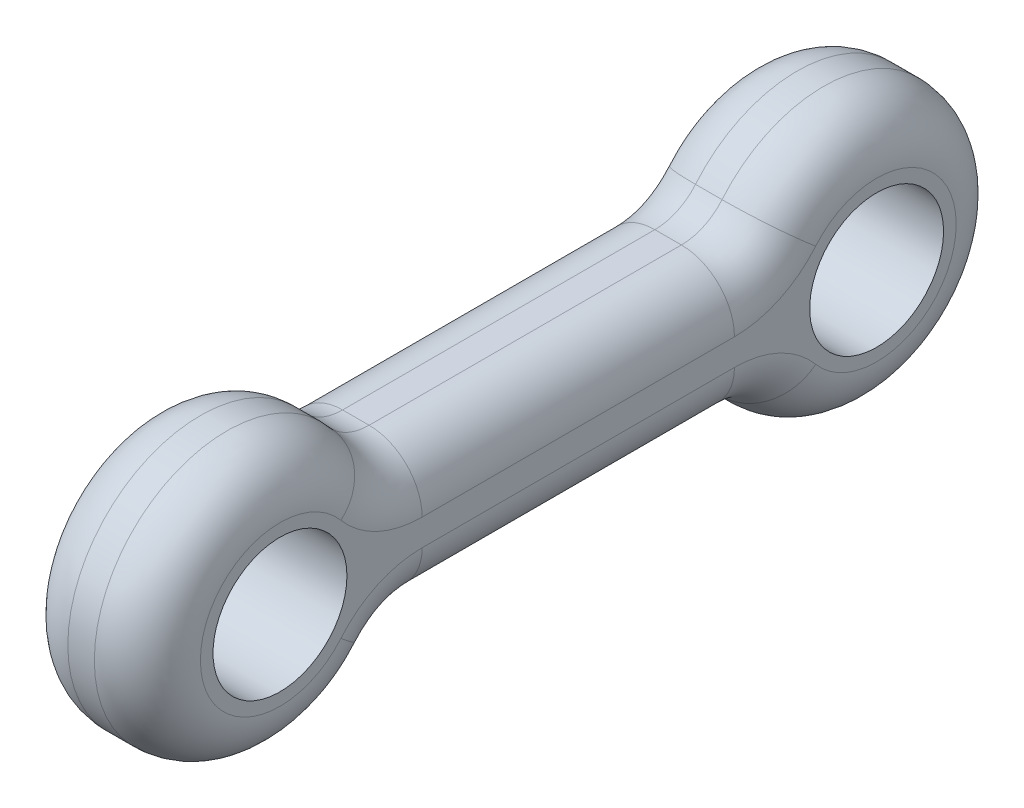
ISO-10303-21;
HEADER;
FILE_DESCRIPTION(('STEP AP214'),'2;1');
FILE_NAME('part.step','',(''),(''),'','','');
FILE_SCHEMA(('AUTOMOTIVE_DESIGN { 1 0 10303 214 1 1 1 1 }'));
ENDSEC;
DATA;
#1=APPLICATION_CONTEXT('core data for automotive mechanical design processes');
#2=APPLICATION_PROTOCOL_DEFINITION('international standard','automotive_design',2000,#1);
#3=PRODUCT_CONTEXT('',#1,'mechanical');
#4=PRODUCT('Part','Part','',(#3));
#5=PRODUCT_RELATED_PRODUCT_CATEGORY('part','',(#4));
#6=PRODUCT_DEFINITION_FORMATION('','',#4);
#7=PRODUCT_DEFINITION_CONTEXT('part definition',#1,'design');
#8=PRODUCT_DEFINITION('design','',#6,#7);
#9=PRODUCT_DEFINITION_SHAPE('','',#8);
#10=(LENGTH_UNIT() NAMED_UNIT(*) SI_UNIT(.MILLI.,.METRE.));
#11=(NAMED_UNIT(*) PLANE_ANGLE_UNIT() SI_UNIT($,.RADIAN.));
#12=(NAMED_UNIT(*) SI_UNIT($,.STERADIAN.) SOLID_ANGLE_UNIT());
#13=UNCERTAINTY_MEASURE_WITH_UNIT(LENGTH_MEASURE(1.E-05),#10,'distance_accuracy_value','');
#14=(GEOMETRIC_REPRESENTATION_CONTEXT(3) GLOBAL_UNCERTAINTY_ASSIGNED_CONTEXT((#13)) GLOBAL_UNIT_ASSIGNED_CONTEXT((#10,
#11,#12)) REPRESENTATION_CONTEXT('',''));
#15=CARTESIAN_POINT('',(0.,0.,0.));
#16=DIRECTION('',(0.,0.,1.));
#17=DIRECTION('',(1.,0.,0.));
#18=AXIS2_PLACEMENT_3D('',#15,#16,#17);
#19=CARTESIAN_POINT('',(0.,0.,0.));
#20=DIRECTION('',(1.,0.,0.));
#21=DIRECTION('',(0.,0.,-1.));
#22=AXIS2_PLACEMENT_3D('',#19,#20,#21);
#23=PLANE('',#22);
#24=CARTESIAN_POINT('',(0.,0.,45.));
#25=DIRECTION('',(1.,0.,0.));
#26=DIRECTION('',(0.,0.,-1.));
#27=AXIS2_PLACEMENT_3D('',#24,#25,#26);
#28=CIRCLE('',#27,5.05);
#29=CARTESIAN_POINT('',(0.,0.,39.95));
#30=VERTEX_POINT('',#29);
#31=EDGE_CURVE('E237',#30,#30,#28,.T.);
#32=ORIENTED_EDGE('',*,*,#31,.T.);
#33=EDGE_LOOP('',(#32));
#34=FACE_BOUND('',#33,.T.);
#35=CARTESIAN_POINT('',(0.,0.,0.));
#36=DIRECTION('',(1.,0.,0.));
#37=DIRECTION('',(0.,0.,-1.));
#38=AXIS2_PLACEMENT_3D('',#35,#36,#37);
#39=CIRCLE('',#38,5.05);
#40=CARTESIAN_POINT('',(0.,0.,-5.05));
#41=VERTEX_POINT('',#40);
#42=EDGE_CURVE('E224',#41,#41,#39,.T.);
#43=ORIENTED_EDGE('',*,*,#42,.T.);
#44=EDGE_LOOP('',(#43));
#45=FACE_BOUND('',#44,.T.);
#46=CARTESIAN_POINT('',(0.,9.,10.7238052947636));
#47=DIRECTION('',(1.,0.,0.));
#48=DIRECTION('',(0.,0.,-1.));
#49=AXIS2_PLACEMENT_3D('',#46,#47,#48);
#50=CIRCLE('',#49,8.);
#51=CARTESIAN_POINT('',(0.,3.85714285714286,4.59591655489869));
#52=VERTEX_POINT('',#51);
#53=CARTESIAN_POINT('',(0.,0.999999999999997,10.7238052947636));
#54=VERTEX_POINT('',#53);
#55=EDGE_CURVE('E301',#52,#54,#50,.F.);
#56=ORIENTED_EDGE('',*,*,#55,.F.);
#57=CARTESIAN_POINT('',(0.,0.,0.));
#58=DIRECTION('',(1.,0.,0.));
#59=DIRECTION('',(0.,0.,-1.));
#60=AXIS2_PLACEMENT_3D('',#57,#58,#59);
#61=CIRCLE('',#60,6.);
#62=CARTESIAN_POINT('',(0.,-3.85714285714286,4.59591655489869));
#63=VERTEX_POINT('',#62);
#64=EDGE_CURVE('E298',#52,#63,#61,.F.);
#65=ORIENTED_EDGE('',*,*,#64,.T.);
#66=CARTESIAN_POINT('',(0.,-9.,10.7238052947636));
#67=DIRECTION('',(1.,0.,0.));
#68=DIRECTION('',(0.,0.,-1.));
#69=AXIS2_PLACEMENT_3D('',#66,#67,#68);
#70=CIRCLE('',#69,8.);
#71=CARTESIAN_POINT('',(0.,-1.,10.7238052947636));
#72=VERTEX_POINT('',#71);
#73=EDGE_CURVE('E295',#72,#63,#70,.F.);
#74=ORIENTED_EDGE('',*,*,#73,.F.);
#75=DIRECTION('',(0.,0.,-1.));
#76=VECTOR('',#75,1.);
#77=CARTESIAN_POINT('',(0.,-0.999999999999991,0.));
#78=LINE('',#77,#76);
#79=CARTESIAN_POINT('',(0.,-1.00000000000003,34.2761947052364));
#80=VERTEX_POINT('',#79);
#81=EDGE_CURVE('E288',#72,#80,#78,.F.);
#82=ORIENTED_EDGE('',*,*,#81,.T.);
#83=CARTESIAN_POINT('',(0.,-9.00000000000003,34.2761947052364));
#84=DIRECTION('',(1.,0.,0.));
#85=DIRECTION('',(0.,0.,-1.));
#86=AXIS2_PLACEMENT_3D('',#83,#84,#85);
#87=CIRCLE('',#86,8.);
#88=CARTESIAN_POINT('',(0.,-3.85714285714287,40.4040834451013));
#89=VERTEX_POINT('',#88);
#90=EDGE_CURVE('E285',#89,#80,#87,.F.);
#91=ORIENTED_EDGE('',*,*,#90,.F.);
#92=CARTESIAN_POINT('',(0.,0.,45.));
#93=DIRECTION('',(1.,0.,0.));
#94=DIRECTION('',(0.,0.,-1.));
#95=AXIS2_PLACEMENT_3D('',#92,#93,#94);
#96=CIRCLE('',#95,6.);
#97=CARTESIAN_POINT('',(0.,3.85714285714284,40.4040834451013));
#98=VERTEX_POINT('',#97);
#99=EDGE_CURVE('E282',#89,#98,#96,.F.);
#100=ORIENTED_EDGE('',*,*,#99,.T.);
#101=CARTESIAN_POINT('',(0.,8.99999999999997,34.2761947052364));
#102=DIRECTION('',(1.,0.,0.));
#103=DIRECTION('',(0.,0.,-1.));
#104=AXIS2_PLACEMENT_3D('',#101,#102,#103);
#105=CIRCLE('',#104,8.);
#106=CARTESIAN_POINT('',(0.,0.999999999999973,34.2761947052363));
#107=VERTEX_POINT('',#106);
#108=EDGE_CURVE('E278',#107,#98,#105,.F.);
#109=ORIENTED_EDGE('',*,*,#108,.F.);
#110=DIRECTION('',(0.,0.,1.));
#111=VECTOR('',#110,1.);
#112=CARTESIAN_POINT('',(0.,1.00000000000001,0.));
#113=LINE('',#112,#111);
#114=EDGE_CURVE('E291',#107,#54,#113,.F.);
#115=ORIENTED_EDGE('',*,*,#114,.T.);
#116=EDGE_LOOP('',(#56,#65,#74,#82,#91,#100,#109,#115));
#117=FACE_BOUND('',#116,.T.);
#118=ADVANCED_FACE('F38',(#34,#45,#117),#23,.F.);
#119=CARTESIAN_POINT('',(10.,0.,0.));
#120=DIRECTION('',(1.,0.,0.));
#121=DIRECTION('',(0.,0.,-1.));
#122=AXIS2_PLACEMENT_3D('',#119,#120,#121);
#123=PLANE('',#122);
#124=CARTESIAN_POINT('',(10.,0.,45.));
#125=DIRECTION('',(1.,0.,0.));
#126=DIRECTION('',(0.,0.,-1.));
#127=AXIS2_PLACEMENT_3D('',#124,#125,#126);
#128=CIRCLE('',#127,5.05);
#129=CARTESIAN_POINT('',(10.,0.,39.95));
#130=VERTEX_POINT('',#129);
#131=EDGE_CURVE('E163',#130,#130,#128,.T.);
#132=ORIENTED_EDGE('',*,*,#131,.F.);
#133=EDGE_LOOP('',(#132));
#134=FACE_BOUND('',#133,.T.);
#135=CARTESIAN_POINT('',(10.,0.,0.));
#136=DIRECTION('',(1.,0.,0.));
#137=DIRECTION('',(0.,0.,-1.));
#138=AXIS2_PLACEMENT_3D('',#135,#136,#137);
#139=CIRCLE('',#138,5.05);
#140=CARTESIAN_POINT('',(10.,0.,-5.05));
#141=VERTEX_POINT('',#140);
#142=EDGE_CURVE('E231',#141,#141,#139,.T.);
#143=ORIENTED_EDGE('',*,*,#142,.F.);
#144=EDGE_LOOP('',(#143));
#145=FACE_BOUND('',#144,.T.);
#146=CARTESIAN_POINT('',(10.,-9.,10.7238052947636));
#147=DIRECTION('',(1.,0.,0.));
#148=DIRECTION('',(0.,0.,-1.));
#149=AXIS2_PLACEMENT_3D('',#146,#147,#148);
#150=CIRCLE('',#149,8.);
#151=CARTESIAN_POINT('',(10.,-3.85714285714286,4.59591655489869));
#152=VERTEX_POINT('',#151);
#153=CARTESIAN_POINT('',(10.,-1.,10.7238052947636));
#154=VERTEX_POINT('',#153);
#155=EDGE_CURVE('E262',#152,#154,#150,.T.);
#156=ORIENTED_EDGE('',*,*,#155,.F.);
#157=CARTESIAN_POINT('',(10.,0.,0.));
#158=DIRECTION('',(1.,0.,0.));
#159=DIRECTION('',(0.,0.,-1.));
#160=AXIS2_PLACEMENT_3D('',#157,#158,#159);
#161=CIRCLE('',#160,6.);
#162=CARTESIAN_POINT('',(10.,3.85714285714286,4.59591655489869));
#163=VERTEX_POINT('',#162);
#164=EDGE_CURVE('E259',#152,#163,#161,.T.);
#165=ORIENTED_EDGE('',*,*,#164,.T.);
#166=CARTESIAN_POINT('',(10.,9.,10.7238052947636));
#167=DIRECTION('',(1.,0.,0.));
#168=DIRECTION('',(0.,0.,-1.));
#169=AXIS2_PLACEMENT_3D('',#166,#167,#168);
#170=CIRCLE('',#169,8.);
#171=CARTESIAN_POINT('',(10.,0.999999999999997,10.7238052947636));
#172=VERTEX_POINT('',#171);
#173=EDGE_CURVE('E255',#172,#163,#170,.T.);
#174=ORIENTED_EDGE('',*,*,#173,.F.);
#175=DIRECTION('',(0.,0.,1.));
#176=VECTOR('',#175,1.);
#177=CARTESIAN_POINT('',(10.,0.999999999999971,36.3397459621556));
#178=LINE('',#177,#176);
#179=CARTESIAN_POINT('',(10.,0.999999999999973,34.2761947052363));
#180=VERTEX_POINT('',#179);
#181=EDGE_CURVE('E251',#172,#180,#178,.T.);
#182=ORIENTED_EDGE('',*,*,#181,.T.);
#183=CARTESIAN_POINT('',(10.,8.99999999999997,34.2761947052364));
#184=DIRECTION('',(1.,0.,0.));
#185=DIRECTION('',(0.,0.,-1.));
#186=AXIS2_PLACEMENT_3D('',#183,#184,#185);
#187=CIRCLE('',#186,8.);
#188=CARTESIAN_POINT('',(10.,3.85714285714284,40.4040834451013));
#189=VERTEX_POINT('',#188);
#190=EDGE_CURVE('E175',#189,#180,#187,.T.);
#191=ORIENTED_EDGE('',*,*,#190,.F.);
#192=CARTESIAN_POINT('',(10.,0.,45.));
#193=DIRECTION('',(1.,0.,0.));
#194=DIRECTION('',(0.,0.,-1.));
#195=AXIS2_PLACEMENT_3D('',#192,#193,#194);
#196=CIRCLE('',#195,6.);
#197=CARTESIAN_POINT('',(10.,-3.85714285714287,40.4040834451013));
#198=VERTEX_POINT('',#197);
#199=EDGE_CURVE('E157',#189,#198,#196,.T.);
#200=ORIENTED_EDGE('',*,*,#199,.T.);
#201=CARTESIAN_POINT('',(10.,-9.00000000000003,34.2761947052364));
#202=DIRECTION('',(1.,0.,0.));
#203=DIRECTION('',(0.,0.,-1.));
#204=AXIS2_PLACEMENT_3D('',#201,#202,#203);
#205=CIRCLE('',#204,8.);
#206=CARTESIAN_POINT('',(10.,-1.00000000000003,34.2761947052364));
#207=VERTEX_POINT('',#206);
#208=EDGE_CURVE('E151',#207,#198,#205,.T.);
#209=ORIENTED_EDGE('',*,*,#208,.F.);
#210=DIRECTION('',(0.,0.,-1.));
#211=VECTOR('',#210,1.);
#212=CARTESIAN_POINT('',(10.,-1.,8.66025403784439));
#213=LINE('',#212,#211);
#214=EDGE_CURVE('E154',#207,#154,#213,.T.);
#215=ORIENTED_EDGE('',*,*,#214,.T.);
#216=EDGE_LOOP('',(#156,#165,#174,#182,#191,#200,#209,#215));
#217=FACE_BOUND('',#216,.T.);
#218=ADVANCED_FACE('F153',(#134,#145,#217),#123,.T.);
#219=CARTESIAN_POINT('',(10.,0.,0.));
#220=DIRECTION('',(-1.,0.,0.));
#221=DIRECTION('',(0.,0.,1.));
#222=AXIS2_PLACEMENT_3D('',#219,#220,#221);
#223=CYLINDRICAL_SURFACE('',#222,10.);
#224=CARTESIAN_POINT('',(6.,0.,0.));
#225=DIRECTION('',(1.,0.,0.));
#226=DIRECTION('',(0.,0.,-1.));
#227=AXIS2_PLACEMENT_3D('',#224,#225,#226);
#228=CIRCLE('',#227,10.);
#229=CARTESIAN_POINT('',(6.,6.42857142857143,7.65986092483115));
#230=VERTEX_POINT('',#229);
#231=CARTESIAN_POINT('',(6.,-6.42857142857143,7.65986092483115));
#232=VERTEX_POINT('',#231);
#233=EDGE_CURVE('E323',#230,#232,#228,.F.);
#234=ORIENTED_EDGE('',*,*,#233,.T.);
#235=DIRECTION('',(-1.,0.,0.));
#236=VECTOR('',#235,1.);
#237=CARTESIAN_POINT('',(10.,-6.42857142857143,7.65986092483115));
#238=LINE('',#237,#236);
#239=CARTESIAN_POINT('',(4.,-6.42857142857143,7.65986092483115));
#240=VERTEX_POINT('',#239);
#241=EDGE_CURVE('E326',#232,#240,#238,.T.);
#242=ORIENTED_EDGE('',*,*,#241,.T.);
#243=CARTESIAN_POINT('',(4.,0.,0.));
#244=DIRECTION('',(1.,0.,0.));
#245=DIRECTION('',(0.,0.,-1.));
#246=AXIS2_PLACEMENT_3D('',#243,#244,#245);
#247=CIRCLE('',#246,10.);
#248=CARTESIAN_POINT('',(4.,6.42857142857143,7.65986092483115));
#249=VERTEX_POINT('',#248);
#250=EDGE_CURVE('E317',#240,#249,#247,.T.);
#251=ORIENTED_EDGE('',*,*,#250,.T.);
#252=DIRECTION('',(-1.,0.,0.));
#253=VECTOR('',#252,1.);
#254=CARTESIAN_POINT('',(10.,6.42857142857143,7.65986092483115));
#255=LINE('',#254,#253);
#256=EDGE_CURVE('E320',#249,#230,#255,.F.);
#257=ORIENTED_EDGE('',*,*,#256,.T.);
#258=EDGE_LOOP('',(#234,#242,#251,#257));
#259=FACE_BOUND('',#258,.T.);
#260=ADVANCED_FACE('F449',(#259),#223,.T.);
#261=CARTESIAN_POINT('',(10.,5.,8.66025403784439));
#262=DIRECTION('',(0.,-1.,0.));
#263=DIRECTION('',(0.,0.,-1.));
#264=AXIS2_PLACEMENT_3D('',#261,#262,#263);
#265=PLANE('',#264);
#266=DIRECTION('',(0.,0.,1.));
#267=VECTOR('',#266,1.);
#268=CARTESIAN_POINT('',(6.,5.,8.66025403784439));
#269=LINE('',#268,#267);
#270=CARTESIAN_POINT('',(6.,4.99999999999997,34.2761947052364));
#271=VERTEX_POINT('',#270);
#272=CARTESIAN_POINT('',(6.,5.,10.7238052947636));
#273=VERTEX_POINT('',#272);
#274=EDGE_CURVE('E271',#271,#273,#269,.F.);
#275=ORIENTED_EDGE('',*,*,#274,.T.);
#276=DIRECTION('',(1.,0.,0.));
#277=VECTOR('',#276,1.);
#278=CARTESIAN_POINT('',(0.,5.,10.7238052947636));
#279=LINE('',#278,#277);
#280=CARTESIAN_POINT('',(4.,5.,10.7238052947636));
#281=VERTEX_POINT('',#280);
#282=EDGE_CURVE('E275',#273,#281,#279,.F.);
#283=ORIENTED_EDGE('',*,*,#282,.T.);
#284=DIRECTION('',(0.,0.,1.));
#285=VECTOR('',#284,1.);
#286=CARTESIAN_POINT('',(4.,5.,8.66025403784439));
#287=LINE('',#286,#285);
#288=CARTESIAN_POINT('',(4.,4.99999999999997,34.2761947052364));
#289=VERTEX_POINT('',#288);
#290=EDGE_CURVE('E268',#281,#289,#287,.T.);
#291=ORIENTED_EDGE('',*,*,#290,.T.);
#292=DIRECTION('',(1.,0.,0.));
#293=VECTOR('',#292,1.);
#294=CARTESIAN_POINT('',(10.,4.99999999999997,34.2761947052364));
#295=LINE('',#294,#293);
#296=EDGE_CURVE('E265',#289,#271,#295,.T.);
#297=ORIENTED_EDGE('',*,*,#296,.T.);
#298=EDGE_LOOP('',(#275,#283,#291,#297));
#299=FACE_BOUND('',#298,.T.);
#300=ADVANCED_FACE('F404',(#299),#265,.F.);
#301=CARTESIAN_POINT('',(10.,0.,45.));
#302=DIRECTION('',(-1.,0.,0.));
#303=DIRECTION('',(0.,0.,1.));
#304=AXIS2_PLACEMENT_3D('',#301,#302,#303);
#305=CYLINDRICAL_SURFACE('',#304,10.);
#306=CARTESIAN_POINT('',(6.,0.,45.));
#307=DIRECTION('',(1.,0.,0.));
#308=DIRECTION('',(0.,0.,-1.));
#309=AXIS2_PLACEMENT_3D('',#306,#307,#308);
#310=CIRCLE('',#309,10.);
#311=CARTESIAN_POINT('',(6.,-6.42857142857145,37.3401390751689));
#312=VERTEX_POINT('',#311);
#313=CARTESIAN_POINT('',(6.,6.42857142857141,37.3401390751688));
#314=VERTEX_POINT('',#313);
#315=EDGE_CURVE('E48',#312,#314,#310,.F.);
#316=ORIENTED_EDGE('',*,*,#315,.T.);
#317=DIRECTION('',(-1.,0.,0.));
#318=VECTOR('',#317,1.);
#319=CARTESIAN_POINT('',(10.,6.42857142857141,37.3401390751688));
#320=LINE('',#319,#318);
#321=CARTESIAN_POINT('',(4.,6.42857142857141,37.3401390751688));
#322=VERTEX_POINT('',#321);
#323=EDGE_CURVE('E11',#314,#322,#320,.T.);
#324=ORIENTED_EDGE('',*,*,#323,.T.);
#325=CARTESIAN_POINT('',(4.,0.,45.));
#326=DIRECTION('',(1.,0.,0.));
#327=DIRECTION('',(0.,0.,-1.));
#328=AXIS2_PLACEMENT_3D('',#325,#326,#327);
#329=CIRCLE('',#328,10.);
#330=CARTESIAN_POINT('',(4.,-6.42857142857145,37.3401390751689));
#331=VERTEX_POINT('',#330);
#332=EDGE_CURVE('E330',#322,#331,#329,.T.);
#333=ORIENTED_EDGE('',*,*,#332,.T.);
#334=DIRECTION('',(-1.,0.,0.));
#335=VECTOR('',#334,1.);
#336=CARTESIAN_POINT('',(10.,-6.42857142857145,37.3401390751689));
#337=LINE('',#336,#335);
#338=EDGE_CURVE('E59',#331,#312,#337,.F.);
#339=ORIENTED_EDGE('',*,*,#338,.T.);
#340=EDGE_LOOP('',(#316,#324,#333,#339));
#341=FACE_BOUND('',#340,.T.);
#342=ADVANCED_FACE('F388',(#341),#305,.T.);
#343=CARTESIAN_POINT('',(10.,-5.,8.66025403784439));
#344=DIRECTION('',(0.,1.,0.));
#345=DIRECTION('',(0.,0.,1.));
#346=AXIS2_PLACEMENT_3D('',#343,#344,#345);
#347=PLANE('',#346);
#348=DIRECTION('',(0.,0.,-1.));
#349=VECTOR('',#348,1.);
#350=CARTESIAN_POINT('',(4.,-5.,8.66025403784439));
#351=LINE('',#350,#349);
#352=CARTESIAN_POINT('',(4.,-5.00000000000003,34.2761947052364));
#353=VERTEX_POINT('',#352);
#354=CARTESIAN_POINT('',(4.,-5.,10.7238052947636));
#355=VERTEX_POINT('',#354);
#356=EDGE_CURVE('E307',#353,#355,#351,.T.);
#357=ORIENTED_EDGE('',*,*,#356,.T.);
#358=DIRECTION('',(1.,0.,0.));
#359=VECTOR('',#358,1.);
#360=CARTESIAN_POINT('',(10.,-5.,10.7238052947636));
#361=LINE('',#360,#359);
#362=CARTESIAN_POINT('',(6.,-5.,10.7238052947636));
#363=VERTEX_POINT('',#362);
#364=EDGE_CURVE('E314',#355,#363,#361,.T.);
#365=ORIENTED_EDGE('',*,*,#364,.T.);
#366=DIRECTION('',(0.,0.,-1.));
#367=VECTOR('',#366,1.);
#368=CARTESIAN_POINT('',(6.,-5.00000000000003,36.3397459621556));
#369=LINE('',#368,#367);
#370=CARTESIAN_POINT('',(6.,-5.00000000000003,34.2761947052364));
#371=VERTEX_POINT('',#370);
#372=EDGE_CURVE('E310',#363,#371,#369,.F.);
#373=ORIENTED_EDGE('',*,*,#372,.T.);
#374=DIRECTION('',(1.,0.,0.));
#375=VECTOR('',#374,1.);
#376=CARTESIAN_POINT('',(0.,-5.00000000000003,34.2761947052364));
#377=LINE('',#376,#375);
#378=EDGE_CURVE('E304',#371,#353,#377,.F.);
#379=ORIENTED_EDGE('',*,*,#378,.T.);
#380=EDGE_LOOP('',(#357,#365,#373,#379));
#381=FACE_BOUND('',#380,.T.);
#382=ADVANCED_FACE('F420',(#381),#347,.F.);
#383=CARTESIAN_POINT('',(10.,0.,45.));
#384=DIRECTION('',(-1.,0.,0.));
#385=DIRECTION('',(0.,0.,1.));
#386=AXIS2_PLACEMENT_3D('',#383,#384,#385);
#387=CYLINDRICAL_SURFACE('',#386,5.05);
#388=ORIENTED_EDGE('',*,*,#131,.T.);
#389=EDGE_LOOP('',(#388));
#390=FACE_BOUND('',#389,.T.);
#391=ORIENTED_EDGE('',*,*,#31,.F.);
#392=EDGE_LOOP('',(#391));
#393=FACE_BOUND('',#392,.T.);
#394=ADVANCED_FACE('F469',(#390,#393),#387,.F.);
#395=CARTESIAN_POINT('',(10.,0.,0.));
#396=DIRECTION('',(-1.,0.,0.));
#397=DIRECTION('',(0.,0.,1.));
#398=AXIS2_PLACEMENT_3D('',#395,#396,#397);
#399=CYLINDRICAL_SURFACE('',#398,5.05);
#400=ORIENTED_EDGE('',*,*,#142,.T.);
#401=EDGE_LOOP('',(#400));
#402=FACE_BOUND('',#401,.T.);
#403=ORIENTED_EDGE('',*,*,#42,.F.);
#404=EDGE_LOOP('',(#403));
#405=FACE_BOUND('',#404,.T.);
#406=ADVANCED_FACE('F487',(#402,#405),#399,.F.);
#407=CARTESIAN_POINT('',(4.,-1.,8.66025403784439));
#408=DIRECTION('',(0.,0.,-1.));
#409=DIRECTION('',(0.,1.,0.));
#410=AXIS2_PLACEMENT_3D('',#407,#408,#409);
#411=CYLINDRICAL_SURFACE('',#410,4.);
#412=CARTESIAN_POINT('',(4.,-1.00000000000003,34.2761947052364));
#413=DIRECTION('',(0.,0.,1.));
#414=DIRECTION('',(0.,-1.,0.));
#415=AXIS2_PLACEMENT_3D('',#412,#413,#414);
#416=CIRCLE('',#415,4.);
#417=EDGE_CURVE('E215',#80,#353,#416,.T.);
#418=ORIENTED_EDGE('',*,*,#417,.F.);
#419=ORIENTED_EDGE('',*,*,#81,.F.);
#420=CARTESIAN_POINT('',(4.,-1.,10.7238052947636));
#421=DIRECTION('',(0.,0.,-1.));
#422=DIRECTION('',(0.,1.,0.));
#423=AXIS2_PLACEMENT_3D('',#420,#421,#422);
#424=CIRCLE('',#423,4.);
#425=EDGE_CURVE('E42',#355,#72,#424,.T.);
#426=ORIENTED_EDGE('',*,*,#425,.F.);
#427=ORIENTED_EDGE('',*,*,#356,.F.);
#428=EDGE_LOOP('',(#418,#419,#426,#427));
#429=FACE_BOUND('',#428,.T.);
#430=ADVANCED_FACE('F40',(#429),#411,.T.);
#431=CARTESIAN_POINT('',(4.,-9.,10.7238052947636));
#432=DIRECTION('',(1.,0.,0.));
#433=DIRECTION('',(0.,0.,-1.));
#434=AXIS2_PLACEMENT_3D('',#431,#432,#433);
#435=TOROIDAL_SURFACE('',#434,8.,4.);
#436=ORIENTED_EDGE('',*,*,#425,.T.);
#437=ORIENTED_EDGE('',*,*,#73,.T.);
#438=CARTESIAN_POINT('',(4.,-3.85714285714286,4.59591655489869));
#439=DIRECTION('',(0.,0.765986092483114,0.642857142857143));
#440=DIRECTION('',(0.,-0.642857142857143,0.765986092483115));
#441=AXIS2_PLACEMENT_3D('',#438,#439,#440);
#442=CIRCLE('',#441,4.);
#443=EDGE_CURVE('E212',#240,#63,#442,.F.);
#444=ORIENTED_EDGE('',*,*,#443,.F.);
#445=CARTESIAN_POINT('',(4.,-9.,10.7238052947636));
#446=DIRECTION('',(1.,0.,0.));
#447=DIRECTION('',(0.,0.,-1.));
#448=AXIS2_PLACEMENT_3D('',#445,#446,#447);
#449=CIRCLE('',#448,4.);
#450=EDGE_CURVE('E208',#355,#240,#449,.F.);
#451=ORIENTED_EDGE('',*,*,#450,.F.);
#452=EDGE_LOOP('',(#436,#437,#444,#451));
#453=FACE_BOUND('',#452,.T.);
#454=ADVANCED_FACE('F447',(#453),#435,.T.);
#455=CARTESIAN_POINT('',(4.,-9.00000000000003,34.2761947052364));
#456=DIRECTION('',(1.,0.,0.));
#457=DIRECTION('',(0.,0.,-1.));
#458=AXIS2_PLACEMENT_3D('',#455,#456,#457);
#459=TOROIDAL_SURFACE('',#458,8.,4.);
#460=ORIENTED_EDGE('',*,*,#90,.T.);
#461=ORIENTED_EDGE('',*,*,#417,.T.);
#462=CARTESIAN_POINT('',(4.,-9.00000000000003,34.2761947052364));
#463=DIRECTION('',(1.,0.,0.));
#464=DIRECTION('',(0.,0.,-1.));
#465=AXIS2_PLACEMENT_3D('',#462,#463,#464);
#466=CIRCLE('',#465,4.);
#467=EDGE_CURVE('E204',#331,#353,#466,.F.);
#468=ORIENTED_EDGE('',*,*,#467,.F.);
#469=CARTESIAN_POINT('',(4.,-3.85714285714287,40.4040834451013));
#470=DIRECTION('',(0.,0.765986092483113,-0.642857142857145));
#471=DIRECTION('',(0.,0.642857142857145,0.765986092483113));
#472=AXIS2_PLACEMENT_3D('',#469,#470,#471);
#473=CIRCLE('',#472,4.);
#474=EDGE_CURVE('E200',#89,#331,#473,.F.);
#475=ORIENTED_EDGE('',*,*,#474,.F.);
#476=EDGE_LOOP('',(#460,#461,#468,#475));
#477=FACE_BOUND('',#476,.T.);
#478=ADVANCED_FACE('F415',(#477),#459,.T.);
#479=CARTESIAN_POINT('',(4.,0.,0.));
#480=DIRECTION('',(1.,0.,0.));
#481=DIRECTION('',(0.,0.,-1.));
#482=AXIS2_PLACEMENT_3D('',#479,#480,#481);
#483=TOROIDAL_SURFACE('',#482,6.,4.);
#484=ORIENTED_EDGE('',*,*,#443,.T.);
#485=ORIENTED_EDGE('',*,*,#64,.F.);
#486=CARTESIAN_POINT('',(4.,3.85714285714285,4.59591655489869));
#487=DIRECTION('',(0.,-0.765986092483115,0.642857142857143));
#488=DIRECTION('',(0.,-0.642857142857143,-0.765986092483115));
#489=AXIS2_PLACEMENT_3D('',#486,#487,#488);
#490=CIRCLE('',#489,4.);
#491=EDGE_CURVE('E192',#249,#52,#490,.T.);
#492=ORIENTED_EDGE('',*,*,#491,.F.);
#493=ORIENTED_EDGE('',*,*,#250,.F.);
#494=EDGE_LOOP('',(#484,#485,#492,#493));
#495=FACE_BOUND('',#494,.T.);
#496=ADVANCED_FACE('F445',(#495),#483,.T.);
#497=CARTESIAN_POINT('',(10.,-9.,10.7238052947636));
#498=DIRECTION('',(-1.,0.,0.));
#499=DIRECTION('',(0.,0.,1.));
#500=AXIS2_PLACEMENT_3D('',#497,#498,#499);
#501=CYLINDRICAL_SURFACE('',#500,4.);
#502=ORIENTED_EDGE('',*,*,#450,.T.);
#503=ORIENTED_EDGE('',*,*,#241,.F.);
#504=CARTESIAN_POINT('',(6.,-9.,10.7238052947636));
#505=DIRECTION('',(1.,0.,0.));
#506=DIRECTION('',(0.,0.,-1.));
#507=AXIS2_PLACEMENT_3D('',#504,#505,#506);
#508=CIRCLE('',#507,4.);
#509=EDGE_CURVE('E183',#363,#232,#508,.F.);
#510=ORIENTED_EDGE('',*,*,#509,.F.);
#511=ORIENTED_EDGE('',*,*,#364,.F.);
#512=EDGE_LOOP('',(#502,#503,#510,#511));
#513=FACE_BOUND('',#512,.T.);
#514=ADVANCED_FACE('F425',(#513),#501,.F.);
#515=CARTESIAN_POINT('',(6.,-0.999999999999991,0.));
#516=DIRECTION('',(0.,0.,1.));
#517=DIRECTION('',(0.,-1.,0.));
#518=AXIS2_PLACEMENT_3D('',#515,#516,#517);
#519=CYLINDRICAL_SURFACE('',#518,4.);
#520=CARTESIAN_POINT('',(6.,-1.00000000000003,34.2761947052364));
#521=DIRECTION('',(0.,0.,1.));
#522=DIRECTION('',(0.,-1.,0.));
#523=AXIS2_PLACEMENT_3D('',#520,#521,#522);
#524=CIRCLE('',#523,4.);
#525=EDGE_CURVE('E169',#371,#207,#524,.T.);
#526=ORIENTED_EDGE('',*,*,#525,.F.);
#527=ORIENTED_EDGE('',*,*,#372,.F.);
#528=CARTESIAN_POINT('',(6.,-1.,10.7238052947636));
#529=DIRECTION('',(0.,0.,-1.));
#530=DIRECTION('',(0.,1.,0.));
#531=AXIS2_PLACEMENT_3D('',#528,#529,#530);
#532=CIRCLE('',#531,4.);
#533=EDGE_CURVE('E172',#154,#363,#532,.T.);
#534=ORIENTED_EDGE('',*,*,#533,.F.);
#535=ORIENTED_EDGE('',*,*,#214,.F.);
#536=EDGE_LOOP('',(#526,#527,#534,#535));
#537=FACE_BOUND('',#536,.T.);
#538=ADVANCED_FACE('F167',(#537),#519,.T.);
#539=CARTESIAN_POINT('',(10.,-9.00000000000003,34.2761947052364));
#540=DIRECTION('',(-1.,0.,0.));
#541=DIRECTION('',(0.,0.,1.));
#542=AXIS2_PLACEMENT_3D('',#539,#540,#541);
#543=CYLINDRICAL_SURFACE('',#542,4.);
#544=ORIENTED_EDGE('',*,*,#467,.T.);
#545=ORIENTED_EDGE('',*,*,#378,.F.);
#546=CARTESIAN_POINT('',(6.,-9.00000000000003,34.2761947052364));
#547=DIRECTION('',(1.,0.,0.));
#548=DIRECTION('',(0.,0.,-1.));
#549=AXIS2_PLACEMENT_3D('',#546,#547,#548);
#550=CIRCLE('',#549,4.);
#551=EDGE_CURVE('E178',#312,#371,#550,.F.);
#552=ORIENTED_EDGE('',*,*,#551,.F.);
#553=ORIENTED_EDGE('',*,*,#338,.F.);
#554=EDGE_LOOP('',(#544,#545,#552,#553));
#555=FACE_BOUND('',#554,.T.);
#556=ADVANCED_FACE('F417',(#555),#543,.F.);
#557=CARTESIAN_POINT('',(4.,0.,45.));
#558=DIRECTION('',(1.,0.,0.));
#559=DIRECTION('',(0.,0.,-1.));
#560=AXIS2_PLACEMENT_3D('',#557,#558,#559);
#561=TOROIDAL_SURFACE('',#560,6.,4.);
#562=ORIENTED_EDGE('',*,*,#474,.T.);
#563=ORIENTED_EDGE('',*,*,#332,.F.);
#564=CARTESIAN_POINT('',(4.,3.85714285714284,40.4040834451013));
#565=DIRECTION('',(0.,-0.765986092483116,-0.642857142857141));
#566=DIRECTION('',(0.,0.642857142857141,-0.765986092483117));
#567=AXIS2_PLACEMENT_3D('',#564,#565,#566);
#568=CIRCLE('',#567,4.);
#569=EDGE_CURVE('E185',#98,#322,#568,.T.);
#570=ORIENTED_EDGE('',*,*,#569,.F.);
#571=ORIENTED_EDGE('',*,*,#99,.F.);
#572=EDGE_LOOP('',(#562,#563,#570,#571));
#573=FACE_BOUND('',#572,.T.);
#574=ADVANCED_FACE('F386',(#573),#561,.T.);
#575=CARTESIAN_POINT('',(4.,0.999999999999999,8.66025403784438));
#576=DIRECTION('',(0.,0.,1.));
#577=DIRECTION('',(0.,-1.,0.));
#578=AXIS2_PLACEMENT_3D('',#575,#576,#577);
#579=CYLINDRICAL_SURFACE('',#578,4.);
#580=CARTESIAN_POINT('',(4.,0.999999999999997,10.7238052947636));
#581=DIRECTION('',(0.,0.,-1.));
#582=DIRECTION('',(0.,1.,0.));
#583=AXIS2_PLACEMENT_3D('',#580,#581,#582);
#584=CIRCLE('',#583,4.);
#585=EDGE_CURVE('E196',#54,#281,#584,.T.);
#586=ORIENTED_EDGE('',*,*,#585,.F.);
#587=ORIENTED_EDGE('',*,*,#114,.F.);
#588=CARTESIAN_POINT('',(4.,0.999999999999972,34.2761947052363));
#589=DIRECTION('',(0.,0.,1.));
#590=DIRECTION('',(0.,-1.,0.));
#591=AXIS2_PLACEMENT_3D('',#588,#589,#590);
#592=CIRCLE('',#591,4.);
#593=EDGE_CURVE('E373',#289,#107,#592,.T.);
#594=ORIENTED_EDGE('',*,*,#593,.F.);
#595=ORIENTED_EDGE('',*,*,#290,.F.);
#596=EDGE_LOOP('',(#586,#587,#594,#595));
#597=FACE_BOUND('',#596,.T.);
#598=ADVANCED_FACE('F411',(#597),#579,.T.);
#599=CARTESIAN_POINT('',(4.,9.,10.7238052947636));
#600=DIRECTION('',(1.,0.,0.));
#601=DIRECTION('',(0.,0.,-1.));
#602=AXIS2_PLACEMENT_3D('',#599,#600,#601);
#603=TOROIDAL_SURFACE('',#602,8.,4.);
#604=ORIENTED_EDGE('',*,*,#55,.T.);
#605=ORIENTED_EDGE('',*,*,#585,.T.);
#606=CARTESIAN_POINT('',(4.,9.,10.7238052947636));
#607=DIRECTION('',(1.,0.,0.));
#608=DIRECTION('',(0.,0.,-1.));
#609=AXIS2_PLACEMENT_3D('',#606,#607,#608);
#610=CIRCLE('',#609,4.);
#611=EDGE_CURVE('E369',#249,#281,#610,.F.);
#612=ORIENTED_EDGE('',*,*,#611,.F.);
#613=ORIENTED_EDGE('',*,*,#491,.T.);
#614=EDGE_LOOP('',(#604,#605,#612,#613));
#615=FACE_BOUND('',#614,.T.);
#616=ADVANCED_FACE('F442',(#615),#603,.T.);
#617=CARTESIAN_POINT('',(6.,-9.,10.7238052947636));
#618=DIRECTION('',(1.,0.,0.));
#619=DIRECTION('',(0.,0.,-1.));
#620=AXIS2_PLACEMENT_3D('',#617,#618,#619);
#621=TOROIDAL_SURFACE('',#620,8.,4.);
#622=ORIENTED_EDGE('',*,*,#533,.T.);
#623=ORIENTED_EDGE('',*,*,#509,.T.);
#624=CARTESIAN_POINT('',(6.,-3.85714285714286,4.59591655489869));
#625=DIRECTION('',(0.,0.765986092483115,0.642857142857143));
#626=DIRECTION('',(0.,-0.642857142857143,0.765986092483115));
#627=AXIS2_PLACEMENT_3D('',#624,#625,#626);
#628=CIRCLE('',#627,4.);
#629=EDGE_CURVE('E365',#152,#232,#628,.F.);
#630=ORIENTED_EDGE('',*,*,#629,.F.);
#631=ORIENTED_EDGE('',*,*,#155,.T.);
#632=EDGE_LOOP('',(#622,#623,#630,#631));
#633=FACE_BOUND('',#632,.T.);
#634=ADVANCED_FACE('F428',(#633),#621,.T.);
#635=CARTESIAN_POINT('',(6.,-9.00000000000003,34.2761947052364));
#636=DIRECTION('',(1.,0.,0.));
#637=DIRECTION('',(0.,0.,-1.));
#638=AXIS2_PLACEMENT_3D('',#635,#636,#637);
#639=TOROIDAL_SURFACE('',#638,8.,4.);
#640=ORIENTED_EDGE('',*,*,#525,.T.);
#641=ORIENTED_EDGE('',*,*,#208,.T.);
#642=CARTESIAN_POINT('',(6.,-3.85714285714287,40.4040834451013));
#643=DIRECTION('',(0.,0.765986092483113,-0.642857142857145));
#644=DIRECTION('',(0.,0.642857142857145,0.765986092483113));
#645=AXIS2_PLACEMENT_3D('',#642,#643,#644);
#646=CIRCLE('',#645,4.);
#647=EDGE_CURVE('E362',#312,#198,#646,.F.);
#648=ORIENTED_EDGE('',*,*,#647,.F.);
#649=ORIENTED_EDGE('',*,*,#551,.T.);
#650=EDGE_LOOP('',(#640,#641,#648,#649));
#651=FACE_BOUND('',#650,.T.);
#652=ADVANCED_FACE('F177',(#651),#639,.T.);
#653=CARTESIAN_POINT('',(4.,8.99999999999997,34.2761947052364));
#654=DIRECTION('',(1.,0.,0.));
#655=DIRECTION('',(0.,0.,-1.));
#656=AXIS2_PLACEMENT_3D('',#653,#654,#655);
#657=TOROIDAL_SURFACE('',#656,8.,4.);
#658=ORIENTED_EDGE('',*,*,#108,.T.);
#659=ORIENTED_EDGE('',*,*,#569,.T.);
#660=CARTESIAN_POINT('',(4.,8.99999999999997,34.2761947052364));
#661=DIRECTION('',(1.,0.,0.));
#662=DIRECTION('',(0.,0.,-1.));
#663=AXIS2_PLACEMENT_3D('',#660,#661,#662);
#664=CIRCLE('',#663,4.);
#665=EDGE_CURVE('E359',#289,#322,#664,.F.);
#666=ORIENTED_EDGE('',*,*,#665,.F.);
#667=ORIENTED_EDGE('',*,*,#593,.T.);
#668=EDGE_LOOP('',(#658,#659,#666,#667));
#669=FACE_BOUND('',#668,.T.);
#670=ADVANCED_FACE('F382',(#669),#657,.T.);
#671=CARTESIAN_POINT('',(10.,9.,10.7238052947636));
#672=DIRECTION('',(-1.,0.,0.));
#673=DIRECTION('',(0.,0.,1.));
#674=AXIS2_PLACEMENT_3D('',#671,#672,#673);
#675=CYLINDRICAL_SURFACE('',#674,4.);
#676=ORIENTED_EDGE('',*,*,#611,.T.);
#677=ORIENTED_EDGE('',*,*,#282,.F.);
#678=CARTESIAN_POINT('',(6.,9.,10.7238052947636));
#679=DIRECTION('',(1.,0.,0.));
#680=DIRECTION('',(0.,0.,-1.));
#681=AXIS2_PLACEMENT_3D('',#678,#679,#680);
#682=CIRCLE('',#681,4.);
#683=EDGE_CURVE('E355',#230,#273,#682,.F.);
#684=ORIENTED_EDGE('',*,*,#683,.F.);
#685=ORIENTED_EDGE('',*,*,#256,.F.);
#686=EDGE_LOOP('',(#676,#677,#684,#685));
#687=FACE_BOUND('',#686,.T.);
#688=ADVANCED_FACE('F439',(#687),#675,.F.);
#689=CARTESIAN_POINT('',(6.,0.,0.));
#690=DIRECTION('',(1.,0.,0.));
#691=DIRECTION('',(0.,0.,-1.));
#692=AXIS2_PLACEMENT_3D('',#689,#690,#691);
#693=TOROIDAL_SURFACE('',#692,6.,4.);
#694=ORIENTED_EDGE('',*,*,#629,.T.);
#695=ORIENTED_EDGE('',*,*,#233,.F.);
#696=CARTESIAN_POINT('',(6.,3.85714285714286,4.59591655489869));
#697=DIRECTION('',(0.,-0.765986092483115,0.642857142857143));
#698=DIRECTION('',(0.,-0.642857142857143,-0.765986092483115));
#699=AXIS2_PLACEMENT_3D('',#696,#697,#698);
#700=CIRCLE('',#699,4.);
#701=EDGE_CURVE('E351',#163,#230,#700,.T.);
#702=ORIENTED_EDGE('',*,*,#701,.F.);
#703=ORIENTED_EDGE('',*,*,#164,.F.);
#704=EDGE_LOOP('',(#694,#695,#702,#703));
#705=FACE_BOUND('',#704,.T.);
#706=ADVANCED_FACE('F433',(#705),#693,.T.);
#707=CARTESIAN_POINT('',(6.,0.,45.));
#708=DIRECTION('',(1.,0.,0.));
#709=DIRECTION('',(0.,0.,-1.));
#710=AXIS2_PLACEMENT_3D('',#707,#708,#709);
#711=TOROIDAL_SURFACE('',#710,6.,4.);
#712=ORIENTED_EDGE('',*,*,#647,.T.);
#713=ORIENTED_EDGE('',*,*,#199,.F.);
#714=CARTESIAN_POINT('',(6.,3.85714285714284,40.4040834451013));
#715=DIRECTION('',(0.,-0.765986092483116,-0.642857142857141));
#716=DIRECTION('',(0.,0.642857142857141,-0.765986092483116));
#717=AXIS2_PLACEMENT_3D('',#714,#715,#716);
#718=CIRCLE('',#717,4.);
#719=EDGE_CURVE('E347',#314,#189,#718,.T.);
#720=ORIENTED_EDGE('',*,*,#719,.F.);
#721=ORIENTED_EDGE('',*,*,#315,.F.);
#722=EDGE_LOOP('',(#712,#713,#720,#721));
#723=FACE_BOUND('',#722,.T.);
#724=ADVANCED_FACE('F395',(#723),#711,.T.);
#725=CARTESIAN_POINT('',(10.,8.99999999999997,34.2761947052364));
#726=DIRECTION('',(-1.,0.,0.));
#727=DIRECTION('',(0.,0.,1.));
#728=AXIS2_PLACEMENT_3D('',#725,#726,#727);
#729=CYLINDRICAL_SURFACE('',#728,4.);
#730=ORIENTED_EDGE('',*,*,#665,.T.);
#731=ORIENTED_EDGE('',*,*,#323,.F.);
#732=CARTESIAN_POINT('',(6.,8.99999999999997,34.2761947052364));
#733=DIRECTION('',(1.,0.,0.));
#734=DIRECTION('',(0.,0.,-1.));
#735=AXIS2_PLACEMENT_3D('',#732,#733,#734);
#736=CIRCLE('',#735,4.);
#737=EDGE_CURVE('E343',#271,#314,#736,.F.);
#738=ORIENTED_EDGE('',*,*,#737,.F.);
#739=ORIENTED_EDGE('',*,*,#296,.F.);
#740=EDGE_LOOP('',(#730,#731,#738,#739));
#741=FACE_BOUND('',#740,.T.);
#742=ADVANCED_FACE('F392',(#741),#729,.F.);
#743=CARTESIAN_POINT('',(6.,9.,10.7238052947636));
#744=DIRECTION('',(1.,0.,0.));
#745=DIRECTION('',(0.,0.,-1.));
#746=AXIS2_PLACEMENT_3D('',#743,#744,#745);
#747=TOROIDAL_SURFACE('',#746,8.,4.);
#748=ORIENTED_EDGE('',*,*,#701,.T.);
#749=ORIENTED_EDGE('',*,*,#683,.T.);
#750=CARTESIAN_POINT('',(6.,0.999999999999997,10.7238052947636));
#751=DIRECTION('',(0.,0.,-1.));
#752=DIRECTION('',(0.,1.,0.));
#753=AXIS2_PLACEMENT_3D('',#750,#751,#752);
#754=CIRCLE('',#753,4.);
#755=EDGE_CURVE('E340',#172,#273,#754,.F.);
#756=ORIENTED_EDGE('',*,*,#755,.F.);
#757=ORIENTED_EDGE('',*,*,#173,.T.);
#758=EDGE_LOOP('',(#748,#749,#756,#757));
#759=FACE_BOUND('',#758,.T.);
#760=ADVANCED_FACE('F436',(#759),#747,.T.);
#761=CARTESIAN_POINT('',(6.,8.99999999999997,34.2761947052364));
#762=DIRECTION('',(1.,0.,0.));
#763=DIRECTION('',(0.,0.,-1.));
#764=AXIS2_PLACEMENT_3D('',#761,#762,#763);
#765=TOROIDAL_SURFACE('',#764,8.,4.);
#766=ORIENTED_EDGE('',*,*,#719,.T.);
#767=ORIENTED_EDGE('',*,*,#190,.T.);
#768=CARTESIAN_POINT('',(6.,0.999999999999973,34.2761947052363));
#769=DIRECTION('',(0.,0.,1.));
#770=DIRECTION('',(0.,-1.,0.));
#771=AXIS2_PLACEMENT_3D('',#768,#769,#770);
#772=CIRCLE('',#771,4.);
#773=EDGE_CURVE('E337',#271,#180,#772,.F.);
#774=ORIENTED_EDGE('',*,*,#773,.F.);
#775=ORIENTED_EDGE('',*,*,#737,.T.);
#776=EDGE_LOOP('',(#766,#767,#774,#775));
#777=FACE_BOUND('',#776,.T.);
#778=ADVANCED_FACE('F398',(#777),#765,.T.);
#779=CARTESIAN_POINT('',(6.,1.00000000000001,0.));
#780=DIRECTION('',(0.,0.,-1.));
#781=DIRECTION('',(0.,1.,0.));
#782=AXIS2_PLACEMENT_3D('',#779,#780,#781);
#783=CYLINDRICAL_SURFACE('',#782,4.);
#784=ORIENTED_EDGE('',*,*,#755,.T.);
#785=ORIENTED_EDGE('',*,*,#274,.F.);
#786=ORIENTED_EDGE('',*,*,#773,.T.);
#787=ORIENTED_EDGE('',*,*,#181,.F.);
#788=EDGE_LOOP('',(#784,#785,#786,#787));
#789=FACE_BOUND('',#788,.T.);
#790=ADVANCED_FACE('F401',(#789),#783,.T.);
#791=CLOSED_SHELL('',(#118,#218,#260,#300,#342,#382,#394,#406,#430,#454,#478,#496,#514,#538,
#556,#574,#598,#616,#634,#652,#670,#688,#706,#724,#742,#760,#778,#790));
#792=MANIFOLD_SOLID_BREP('B2',#791);
#793=ADVANCED_BREP_SHAPE_REPRESENTATION('',(#18,#792),#14);
#794=SHAPE_DEFINITION_REPRESENTATION(#9,#793);
ENDSEC;
END-ISO-10303-21;
